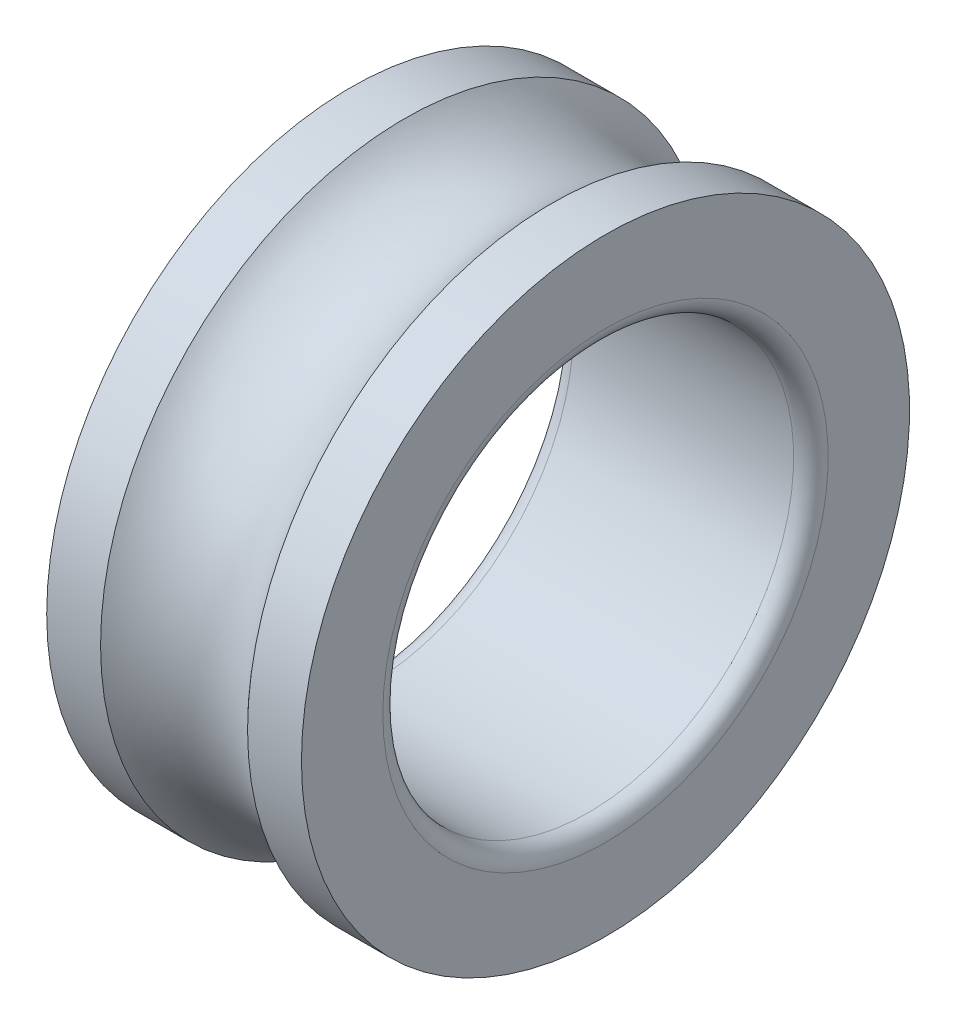
ISO-10303-21;
HEADER;
FILE_DESCRIPTION(('STEP AP214'),'2;1');
FILE_NAME('part.step','',(''),(''),'','','');
FILE_SCHEMA(('AUTOMOTIVE_DESIGN { 1 0 10303 214 1 1 1 1 }'));
ENDSEC;
DATA;
#1=APPLICATION_CONTEXT('core data for automotive mechanical design processes');
#2=APPLICATION_PROTOCOL_DEFINITION('international standard','automotive_design',2000,#1);
#3=PRODUCT_CONTEXT('',#1,'mechanical');
#4=PRODUCT('Part','Part','',(#3));
#5=PRODUCT_RELATED_PRODUCT_CATEGORY('part','',(#4));
#6=PRODUCT_DEFINITION_FORMATION('','',#4);
#7=PRODUCT_DEFINITION_CONTEXT('part definition',#1,'design');
#8=PRODUCT_DEFINITION('design','',#6,#7);
#9=PRODUCT_DEFINITION_SHAPE('','',#8);
#10=(LENGTH_UNIT() NAMED_UNIT(*) SI_UNIT(.MILLI.,.METRE.));
#11=(NAMED_UNIT(*) PLANE_ANGLE_UNIT() SI_UNIT($,.RADIAN.));
#12=(NAMED_UNIT(*) SI_UNIT($,.STERADIAN.) SOLID_ANGLE_UNIT());
#13=UNCERTAINTY_MEASURE_WITH_UNIT(LENGTH_MEASURE(1.E-05),#10,'distance_accuracy_value','');
#14=(GEOMETRIC_REPRESENTATION_CONTEXT(3) GLOBAL_UNCERTAINTY_ASSIGNED_CONTEXT((#13)) GLOBAL_UNIT_ASSIGNED_CONTEXT((#10,
#11,#12)) REPRESENTATION_CONTEXT('',''));
#15=CARTESIAN_POINT('',(0.,0.,0.));
#16=DIRECTION('',(0.,0.,1.));
#17=DIRECTION('',(1.,0.,0.));
#18=AXIS2_PLACEMENT_3D('',#15,#16,#17);
#19=CARTESIAN_POINT('',(1.55,3.7,0.));
#20=DIRECTION('',(-1.,0.,0.));
#21=DIRECTION('',(0.,0.,1.));
#22=AXIS2_PLACEMENT_3D('',#19,#20,#21);
#23=PLANE('',#22);
#24=CARTESIAN_POINT('',(1.55,0.,0.));
#25=DIRECTION('',(-1.,0.,0.));
#26=DIRECTION('',(0.,0.,1.));
#27=AXIS2_PLACEMENT_3D('',#24,#25,#26);
#28=CIRCLE('',#27,2.71);
#29=CARTESIAN_POINT('',(1.55,0.,2.71));
#30=VERTEX_POINT('',#29);
#31=EDGE_CURVE('E10',#30,#30,#28,.T.);
#32=ORIENTED_EDGE('',*,*,#31,.T.);
#33=EDGE_LOOP('',(#32));
#34=FACE_BOUND('',#33,.T.);
#35=CARTESIAN_POINT('',(1.55,0.,0.));
#36=DIRECTION('',(-1.,0.,0.));
#37=DIRECTION('',(0.,0.,1.));
#38=AXIS2_PLACEMENT_3D('',#35,#36,#37);
#39=CIRCLE('',#38,3.7);
#40=CARTESIAN_POINT('',(1.55,0.,3.7));
#41=VERTEX_POINT('',#40);
#42=EDGE_CURVE('E74',#41,#41,#39,.T.);
#43=ORIENTED_EDGE('',*,*,#42,.F.);
#44=EDGE_LOOP('',(#43));
#45=FACE_BOUND('',#44,.T.);
#46=ADVANCED_FACE('F38',(#34,#45),#23,.F.);
#47=CARTESIAN_POINT('',(-1.11359223300971,0.,0.));
#48=DIRECTION('',(-1.,0.,0.));
#49=DIRECTION('',(0.,0.,1.));
#50=AXIS2_PLACEMENT_3D('',#47,#48,#49);
#51=CYLINDRICAL_SURFACE('',#50,2.5);
#52=CARTESIAN_POINT('',(-1.34,0.,0.));
#53=DIRECTION('',(1.,0.,0.));
#54=DIRECTION('',(0.,0.,-1.));
#55=AXIS2_PLACEMENT_3D('',#52,#53,#54);
#56=CIRCLE('',#55,2.5);
#57=CARTESIAN_POINT('',(-1.34,0.,-2.5));
#58=VERTEX_POINT('',#57);
#59=EDGE_CURVE('E51',#58,#58,#56,.F.);
#60=ORIENTED_EDGE('',*,*,#59,.T.);
#61=EDGE_LOOP('',(#60));
#62=FACE_BOUND('',#61,.T.);
#63=CARTESIAN_POINT('',(1.34,0.,0.));
#64=DIRECTION('',(-1.,0.,0.));
#65=DIRECTION('',(0.,0.,1.));
#66=AXIS2_PLACEMENT_3D('',#63,#64,#65);
#67=CIRCLE('',#66,2.5);
#68=CARTESIAN_POINT('',(1.34,0.,2.5));
#69=VERTEX_POINT('',#68);
#70=EDGE_CURVE('E56',#69,#69,#67,.F.);
#71=ORIENTED_EDGE('',*,*,#70,.T.);
#72=EDGE_LOOP('',(#71));
#73=FACE_BOUND('',#72,.T.);
#74=ADVANCED_FACE('F82',(#62,#73),#51,.F.);
#75=CARTESIAN_POINT('',(-1.55,3.7,0.));
#76=DIRECTION('',(1.,0.,0.));
#77=DIRECTION('',(0.,0.,-1.));
#78=AXIS2_PLACEMENT_3D('',#75,#76,#77);
#79=PLANE('',#78);
#80=CARTESIAN_POINT('',(-1.55,0.,0.));
#81=DIRECTION('',(1.,0.,0.));
#82=DIRECTION('',(0.,0.,-1.));
#83=AXIS2_PLACEMENT_3D('',#80,#81,#82);
#84=CIRCLE('',#83,2.71);
#85=CARTESIAN_POINT('',(-1.55,0.,-2.71));
#86=VERTEX_POINT('',#85);
#87=EDGE_CURVE('E46',#86,#86,#84,.T.);
#88=ORIENTED_EDGE('',*,*,#87,.T.);
#89=EDGE_LOOP('',(#88));
#90=FACE_BOUND('',#89,.T.);
#91=CARTESIAN_POINT('',(-1.55,0.,0.));
#92=DIRECTION('',(-1.,0.,0.));
#93=DIRECTION('',(0.,0.,1.));
#94=AXIS2_PLACEMENT_3D('',#91,#92,#93);
#95=CIRCLE('',#94,3.7);
#96=CARTESIAN_POINT('',(-1.55,0.,3.7));
#97=VERTEX_POINT('',#96);
#98=EDGE_CURVE('E62',#97,#97,#95,.T.);
#99=ORIENTED_EDGE('',*,*,#98,.T.);
#100=EDGE_LOOP('',(#99));
#101=FACE_BOUND('',#100,.T.);
#102=ADVANCED_FACE('F87',(#90,#101),#79,.F.);
#103=CARTESIAN_POINT('',(-1.11359223300971,0.,0.));
#104=DIRECTION('',(-1.,0.,0.));
#105=DIRECTION('',(0.,0.,1.));
#106=AXIS2_PLACEMENT_3D('',#103,#104,#105);
#107=CYLINDRICAL_SURFACE('',#106,3.7);
#108=ORIENTED_EDGE('',*,*,#98,.F.);
#109=EDGE_LOOP('',(#108));
#110=FACE_BOUND('',#109,.T.);
#111=CARTESIAN_POINT('',(-0.894427190999916,0.,0.));
#112=DIRECTION('',(-1.,0.,0.));
#113=DIRECTION('',(0.,0.,1.));
#114=AXIS2_PLACEMENT_3D('',#111,#112,#113);
#115=CIRCLE('',#114,3.7);
#116=CARTESIAN_POINT('',(-0.894427190999916,0.,3.7));
#117=VERTEX_POINT('',#116);
#118=EDGE_CURVE('E66',#117,#117,#115,.T.);
#119=ORIENTED_EDGE('',*,*,#118,.T.);
#120=EDGE_LOOP('',(#119));
#121=FACE_BOUND('',#120,.T.);
#122=ADVANCED_FACE('F110',(#110,#121),#107,.T.);
#123=CARTESIAN_POINT('',(0.,0.,0.));
#124=DIRECTION('',(-1.,0.,0.));
#125=DIRECTION('',(0.,0.,1.));
#126=AXIS2_PLACEMENT_3D('',#123,#124,#125);
#127=TOROIDAL_SURFACE('',#126,4.5,1.2);
#128=ORIENTED_EDGE('',*,*,#118,.F.);
#129=EDGE_LOOP('',(#128));
#130=FACE_BOUND('',#129,.T.);
#131=CARTESIAN_POINT('',(0.894427190999916,0.,0.));
#132=DIRECTION('',(-1.,0.,0.));
#133=DIRECTION('',(0.,0.,1.));
#134=AXIS2_PLACEMENT_3D('',#131,#132,#133);
#135=CIRCLE('',#134,3.7);
#136=CARTESIAN_POINT('',(0.894427190999916,0.,3.7));
#137=VERTEX_POINT('',#136);
#138=EDGE_CURVE('E70',#137,#137,#135,.T.);
#139=ORIENTED_EDGE('',*,*,#138,.T.);
#140=EDGE_LOOP('',(#139));
#141=FACE_BOUND('',#140,.T.);
#142=ADVANCED_FACE('F99',(#130,#141),#127,.F.);
#143=CARTESIAN_POINT('',(-1.11359223300971,0.,0.));
#144=DIRECTION('',(-1.,0.,0.));
#145=DIRECTION('',(0.,0.,1.));
#146=AXIS2_PLACEMENT_3D('',#143,#144,#145);
#147=CYLINDRICAL_SURFACE('',#146,3.7);
#148=ORIENTED_EDGE('',*,*,#138,.F.);
#149=EDGE_LOOP('',(#148));
#150=FACE_BOUND('',#149,.T.);
#151=ORIENTED_EDGE('',*,*,#42,.T.);
#152=EDGE_LOOP('',(#151));
#153=FACE_BOUND('',#152,.T.);
#154=ADVANCED_FACE('F79',(#150,#153),#147,.T.);
#155=CARTESIAN_POINT('',(-1.34,0.,0.));
#156=DIRECTION('',(1.,0.,0.));
#157=DIRECTION('',(0.,0.,-1.));
#158=AXIS2_PLACEMENT_3D('',#155,#156,#157);
#159=TOROIDAL_SURFACE('',#158,2.71,0.21);
#160=ORIENTED_EDGE('',*,*,#87,.F.);
#161=EDGE_LOOP('',(#160));
#162=FACE_BOUND('',#161,.T.);
#163=ORIENTED_EDGE('',*,*,#59,.F.);
#164=EDGE_LOOP('',(#163));
#165=FACE_BOUND('',#164,.T.);
#166=ADVANCED_FACE('F91',(#162,#165),#159,.T.);
#167=CARTESIAN_POINT('',(1.34,0.,0.));
#168=DIRECTION('',(-1.,0.,0.));
#169=DIRECTION('',(0.,0.,1.));
#170=AXIS2_PLACEMENT_3D('',#167,#168,#169);
#171=TOROIDAL_SURFACE('',#170,2.71,0.21);
#172=ORIENTED_EDGE('',*,*,#70,.F.);
#173=EDGE_LOOP('',(#172));
#174=FACE_BOUND('',#173,.T.);
#175=ORIENTED_EDGE('',*,*,#31,.F.);
#176=EDGE_LOOP('',(#175));
#177=FACE_BOUND('',#176,.T.);
#178=ADVANCED_FACE('F40',(#174,#177),#171,.T.);
#179=CLOSED_SHELL('',(#46,#74,#102,#122,#142,#154,#166,#178));
#180=MANIFOLD_SOLID_BREP('B2',#179);
#181=ADVANCED_BREP_SHAPE_REPRESENTATION('',(#18,#180),#14);
#182=SHAPE_DEFINITION_REPRESENTATION(#9,#181);
ENDSEC;
END-ISO-10303-21;
